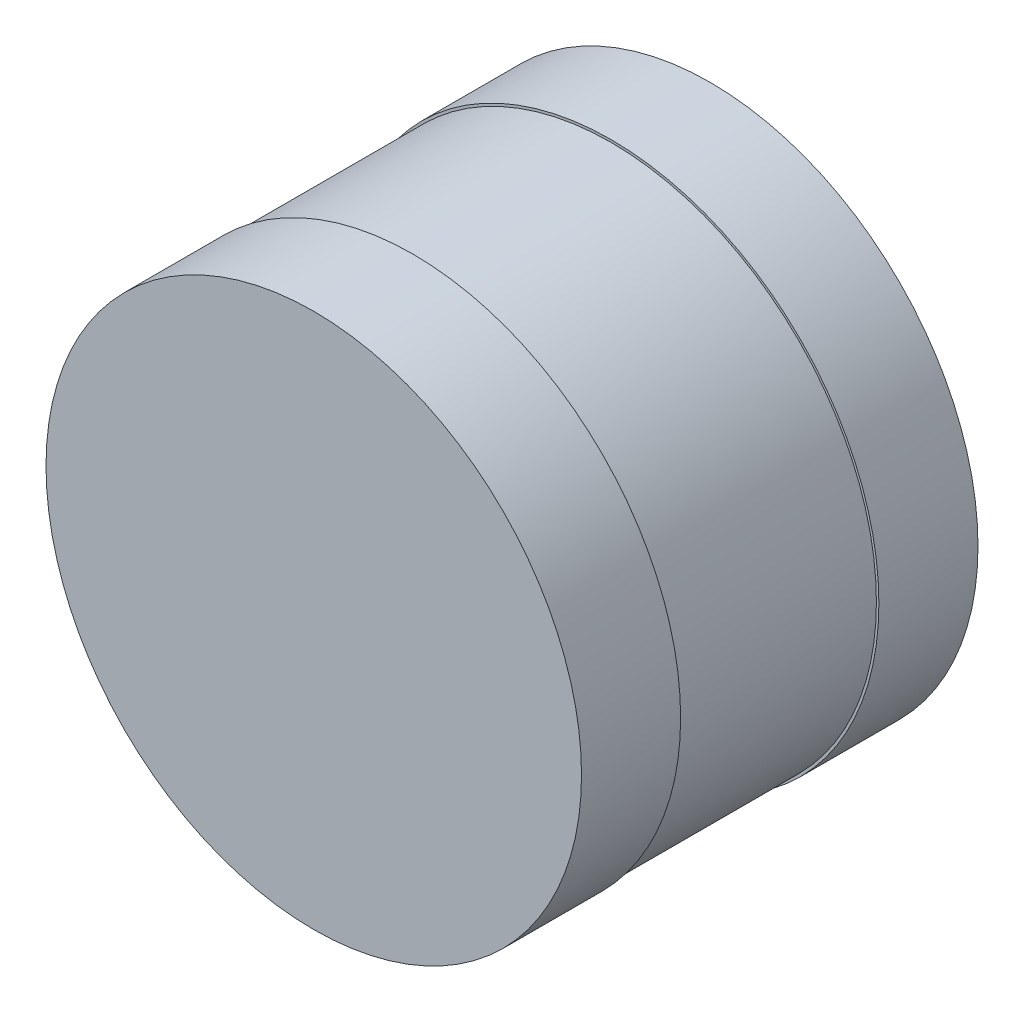
ISO-10303-21;
HEADER;
FILE_DESCRIPTION(('STEP AP214'),'2;1');
FILE_NAME('part.step','',(''),(''),'','','');
FILE_SCHEMA(('AUTOMOTIVE_DESIGN { 1 0 10303 214 1 1 1 1 }'));
ENDSEC;
DATA;
#1=APPLICATION_CONTEXT('core data for automotive mechanical design processes');
#2=APPLICATION_PROTOCOL_DEFINITION('international standard','automotive_design',2000,#1);
#3=PRODUCT_CONTEXT('',#1,'mechanical');
#4=PRODUCT('Part','Part','',(#3));
#5=PRODUCT_RELATED_PRODUCT_CATEGORY('part','',(#4));
#6=PRODUCT_DEFINITION_FORMATION('','',#4);
#7=PRODUCT_DEFINITION_CONTEXT('part definition',#1,'design');
#8=PRODUCT_DEFINITION('design','',#6,#7);
#9=PRODUCT_DEFINITION_SHAPE('','',#8);
#10=(LENGTH_UNIT() NAMED_UNIT(*) SI_UNIT(.MILLI.,.METRE.));
#11=(NAMED_UNIT(*) PLANE_ANGLE_UNIT() SI_UNIT($,.RADIAN.));
#12=(NAMED_UNIT(*) SI_UNIT($,.STERADIAN.) SOLID_ANGLE_UNIT());
#13=UNCERTAINTY_MEASURE_WITH_UNIT(LENGTH_MEASURE(1.E-05),#10,'distance_accuracy_value','');
#14=(GEOMETRIC_REPRESENTATION_CONTEXT(3) GLOBAL_UNCERTAINTY_ASSIGNED_CONTEXT((#13)) GLOBAL_UNIT_ASSIGNED_CONTEXT((#10,
#11,#12)) REPRESENTATION_CONTEXT('',''));
#15=CARTESIAN_POINT('',(0.,0.,0.));
#16=DIRECTION('',(0.,0.,1.));
#17=DIRECTION('',(1.,0.,0.));
#18=AXIS2_PLACEMENT_3D('',#15,#16,#17);
#19=CARTESIAN_POINT('',(0.,0.,20.175));
#20=DIRECTION('',(0.,0.,-1.));
#21=DIRECTION('',(-1.,0.,0.));
#22=AXIS2_PLACEMENT_3D('',#19,#20,#21);
#23=CYLINDRICAL_SURFACE('',#22,54.5);
#24=CARTESIAN_POINT('',(0.,0.,20.175));
#25=DIRECTION('',(0.,0.,1.));
#26=DIRECTION('',(1.,0.,0.));
#27=AXIS2_PLACEMENT_3D('',#24,#25,#26);
#28=CIRCLE('',#27,54.5);
#29=CARTESIAN_POINT('',(54.5,0.,20.175));
#30=VERTEX_POINT('',#29);
#31=EDGE_CURVE('E57',#30,#30,#28,.T.);
#32=ORIENTED_EDGE('',*,*,#31,.F.);
#33=EDGE_LOOP('',(#32));
#34=FACE_BOUND('',#33,.T.);
#35=CARTESIAN_POINT('',(0.,0.,0.));
#36=DIRECTION('',(0.,0.,1.));
#37=DIRECTION('',(1.,0.,0.));
#38=AXIS2_PLACEMENT_3D('',#35,#36,#37);
#39=CIRCLE('',#38,54.5);
#40=CARTESIAN_POINT('',(54.5,0.,0.));
#41=VERTEX_POINT('',#40);
#42=EDGE_CURVE('E52',#41,#41,#39,.T.);
#43=ORIENTED_EDGE('',*,*,#42,.T.);
#44=EDGE_LOOP('',(#43));
#45=FACE_BOUND('',#44,.T.);
#46=ADVANCED_FACE('F49',(#34,#45),#23,.T.);
#47=CARTESIAN_POINT('',(0.,0.,20.175));
#48=DIRECTION('',(0.,0.,1.));
#49=DIRECTION('',(1.,0.,0.));
#50=AXIS2_PLACEMENT_3D('',#47,#48,#49);
#51=PLANE('',#50);
#52=ORIENTED_EDGE('',*,*,#31,.T.);
#53=EDGE_LOOP('',(#52));
#54=FACE_BOUND('',#53,.T.);
#55=ADVANCED_FACE('F96',(#54),#51,.T.);
#56=CARTESIAN_POINT('',(0.,0.,0.));
#57=DIRECTION('',(0.,0.,1.));
#58=DIRECTION('',(1.,0.,0.));
#59=AXIS2_PLACEMENT_3D('',#56,#57,#58);
#60=PLANE('',#59);
#61=CARTESIAN_POINT('',(0.,0.,0.));
#62=DIRECTION('',(0.,0.,-1.));
#63=DIRECTION('',(-1.,0.,0.));
#64=AXIS2_PLACEMENT_3D('',#61,#62,#63);
#65=CIRCLE('',#64,54.);
#66=CARTESIAN_POINT('',(-54.,0.,0.));
#67=VERTEX_POINT('',#66);
#68=EDGE_CURVE('E10',#67,#67,#65,.T.);
#69=ORIENTED_EDGE('',*,*,#68,.F.);
#70=EDGE_LOOP('',(#69));
#71=FACE_BOUND('',#70,.T.);
#72=ORIENTED_EDGE('',*,*,#42,.F.);
#73=EDGE_LOOP('',(#72));
#74=FACE_BOUND('',#73,.T.);
#75=ADVANCED_FACE('F101',(#71,#74),#60,.F.);
#76=CARTESIAN_POINT('',(0.,0.,-40.35));
#77=DIRECTION('',(0.,0.,1.));
#78=DIRECTION('',(1.,0.,0.));
#79=AXIS2_PLACEMENT_3D('',#76,#77,#78);
#80=CYLINDRICAL_SURFACE('',#79,54.);
#81=CARTESIAN_POINT('',(0.,0.,-40.35));
#82=DIRECTION('',(0.,0.,-1.));
#83=DIRECTION('',(-1.,0.,0.));
#84=AXIS2_PLACEMENT_3D('',#81,#82,#83);
#85=CIRCLE('',#84,54.);
#86=CARTESIAN_POINT('',(-54.,0.,-40.35));
#87=VERTEX_POINT('',#86);
#88=EDGE_CURVE('E64',#87,#87,#85,.T.);
#89=ORIENTED_EDGE('',*,*,#88,.F.);
#90=EDGE_LOOP('',(#89));
#91=FACE_BOUND('',#90,.T.);
#92=ORIENTED_EDGE('',*,*,#68,.T.);
#93=EDGE_LOOP('',(#92));
#94=FACE_BOUND('',#93,.T.);
#95=ADVANCED_FACE('F82',(#91,#94),#80,.T.);
#96=CARTESIAN_POINT('',(0.,0.,-60.525));
#97=DIRECTION('',(0.,0.,1.));
#98=DIRECTION('',(1.,0.,0.));
#99=AXIS2_PLACEMENT_3D('',#96,#97,#98);
#100=CYLINDRICAL_SURFACE('',#99,54.5);
#101=CARTESIAN_POINT('',(0.,0.,-60.525));
#102=DIRECTION('',(0.,0.,-1.));
#103=DIRECTION('',(-1.,0.,0.));
#104=AXIS2_PLACEMENT_3D('',#101,#102,#103);
#105=CIRCLE('',#104,54.5);
#106=CARTESIAN_POINT('',(-54.5,0.,-60.525));
#107=VERTEX_POINT('',#106);
#108=EDGE_CURVE('E68',#107,#107,#105,.T.);
#109=ORIENTED_EDGE('',*,*,#108,.F.);
#110=EDGE_LOOP('',(#109));
#111=FACE_BOUND('',#110,.T.);
#112=CARTESIAN_POINT('',(0.,0.,-40.35));
#113=DIRECTION('',(0.,0.,-1.));
#114=DIRECTION('',(-1.,0.,0.));
#115=AXIS2_PLACEMENT_3D('',#112,#113,#114);
#116=CIRCLE('',#115,54.5);
#117=CARTESIAN_POINT('',(-54.5,0.,-40.35));
#118=VERTEX_POINT('',#117);
#119=EDGE_CURVE('E69',#118,#118,#116,.T.);
#120=ORIENTED_EDGE('',*,*,#119,.T.);
#121=EDGE_LOOP('',(#120));
#122=FACE_BOUND('',#121,.T.);
#123=ADVANCED_FACE('F79',(#111,#122),#100,.T.);
#124=CARTESIAN_POINT('',(0.,0.,-60.525));
#125=DIRECTION('',(0.,0.,-1.));
#126=DIRECTION('',(-1.,0.,0.));
#127=AXIS2_PLACEMENT_3D('',#124,#125,#126);
#128=PLANE('',#127);
#129=ORIENTED_EDGE('',*,*,#108,.T.);
#130=EDGE_LOOP('',(#129));
#131=FACE_BOUND('',#130,.T.);
#132=ADVANCED_FACE('F77',(#131),#128,.T.);
#133=CARTESIAN_POINT('',(0.,0.,-40.35));
#134=DIRECTION('',(0.,0.,-1.));
#135=DIRECTION('',(-1.,0.,0.));
#136=AXIS2_PLACEMENT_3D('',#133,#134,#135);
#137=PLANE('',#136);
#138=ORIENTED_EDGE('',*,*,#88,.T.);
#139=EDGE_LOOP('',(#138));
#140=FACE_BOUND('',#139,.T.);
#141=ORIENTED_EDGE('',*,*,#119,.F.);
#142=EDGE_LOOP('',(#141));
#143=FACE_BOUND('',#142,.T.);
#144=ADVANCED_FACE('F86',(#140,#143),#137,.F.);
#145=CLOSED_SHELL('',(#46,#55,#75,#95,#123,#132,#144));
#146=MANIFOLD_SOLID_BREP('B2',#145);
#147=ADVANCED_BREP_SHAPE_REPRESENTATION('',(#18,#146),#14);
#148=SHAPE_DEFINITION_REPRESENTATION(#9,#147);
ENDSEC;
END-ISO-10303-21;
